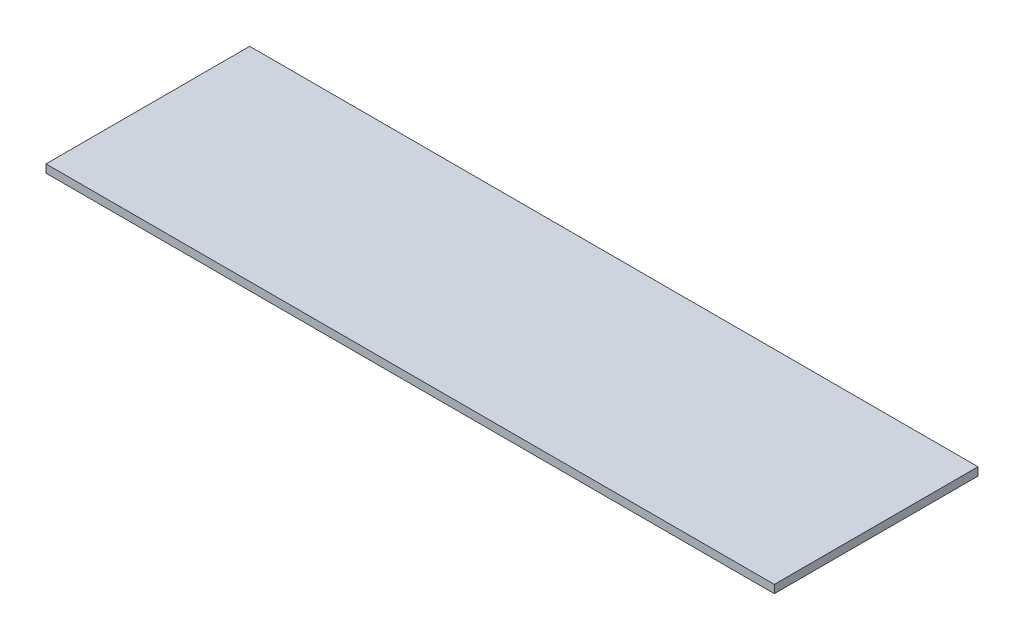
ISO-10303-21;
HEADER;
FILE_DESCRIPTION(('STEP AP214'),'2;1');
FILE_NAME('part.step','',(''),(''),'','','');
FILE_SCHEMA(('AUTOMOTIVE_DESIGN { 1 0 10303 214 1 1 1 1 }'));
ENDSEC;
DATA;
#1=APPLICATION_CONTEXT('core data for automotive mechanical design processes');
#2=APPLICATION_PROTOCOL_DEFINITION('international standard','automotive_design',2000,#1);
#3=PRODUCT_CONTEXT('',#1,'mechanical');
#4=PRODUCT('Part','Part','',(#3));
#5=PRODUCT_RELATED_PRODUCT_CATEGORY('part','',(#4));
#6=PRODUCT_DEFINITION_FORMATION('','',#4);
#7=PRODUCT_DEFINITION_CONTEXT('part definition',#1,'design');
#8=PRODUCT_DEFINITION('design','',#6,#7);
#9=PRODUCT_DEFINITION_SHAPE('','',#8);
#10=(LENGTH_UNIT() NAMED_UNIT(*) SI_UNIT(.MILLI.,.METRE.));
#11=(NAMED_UNIT(*) PLANE_ANGLE_UNIT() SI_UNIT($,.RADIAN.));
#12=(NAMED_UNIT(*) SI_UNIT($,.STERADIAN.) SOLID_ANGLE_UNIT());
#13=UNCERTAINTY_MEASURE_WITH_UNIT(LENGTH_MEASURE(1.E-05),#10,'distance_accuracy_value','');
#14=(GEOMETRIC_REPRESENTATION_CONTEXT(3) GLOBAL_UNCERTAINTY_ASSIGNED_CONTEXT((#13)) GLOBAL_UNIT_ASSIGNED_CONTEXT((#10,
#11,#12)) REPRESENTATION_CONTEXT('',''));
#15=CARTESIAN_POINT('',(0.,0.,0.));
#16=DIRECTION('',(0.,0.,1.));
#17=DIRECTION('',(1.,0.,0.));
#18=AXIS2_PLACEMENT_3D('',#15,#16,#17);
#19=CARTESIAN_POINT('',(450.,5.,-125.85));
#20=DIRECTION('',(-1.,0.,0.));
#21=DIRECTION('',(0.,0.,1.));
#22=AXIS2_PLACEMENT_3D('',#19,#20,#21);
#23=PLANE('',#22);
#24=DIRECTION('',(0.,0.,-1.));
#25=VECTOR('',#24,1.);
#26=CARTESIAN_POINT('',(450.,-5.,-125.85));
#27=LINE('',#26,#25);
#28=CARTESIAN_POINT('',(450.,-5.,125.85));
#29=VERTEX_POINT('',#28);
#30=CARTESIAN_POINT('',(450.,-5.,-125.85));
#31=VERTEX_POINT('',#30);
#32=EDGE_CURVE('E109',#29,#31,#27,.T.);
#33=ORIENTED_EDGE('',*,*,#32,.T.);
#34=DIRECTION('',(0.,-1.,0.));
#35=VECTOR('',#34,1.);
#36=CARTESIAN_POINT('',(450.,5.,-125.85));
#37=LINE('',#36,#35);
#38=CARTESIAN_POINT('',(450.,5.,-125.85));
#39=VERTEX_POINT('',#38);
#40=EDGE_CURVE('E11',#39,#31,#37,.T.);
#41=ORIENTED_EDGE('',*,*,#40,.F.);
#42=DIRECTION('',(0.,0.,-1.));
#43=VECTOR('',#42,1.);
#44=CARTESIAN_POINT('',(450.,5.,-125.85));
#45=LINE('',#44,#43);
#46=CARTESIAN_POINT('',(450.,5.,125.85));
#47=VERTEX_POINT('',#46);
#48=EDGE_CURVE('E93',#47,#39,#45,.T.);
#49=ORIENTED_EDGE('',*,*,#48,.F.);
#50=DIRECTION('',(0.,-1.,0.));
#51=VECTOR('',#50,1.);
#52=CARTESIAN_POINT('',(450.,5.,125.85));
#53=LINE('',#52,#51);
#54=EDGE_CURVE('E105',#47,#29,#53,.T.);
#55=ORIENTED_EDGE('',*,*,#54,.T.);
#56=EDGE_LOOP('',(#33,#41,#49,#55));
#57=FACE_BOUND('',#56,.T.);
#58=ADVANCED_FACE('F41',(#57),#23,.F.);
#59=CARTESIAN_POINT('',(-450.,5.,-125.85));
#60=DIRECTION('',(0.,0.,1.));
#61=DIRECTION('',(1.,0.,0.));
#62=AXIS2_PLACEMENT_3D('',#59,#60,#61);
#63=PLANE('',#62);
#64=DIRECTION('',(-1.,0.,0.));
#65=VECTOR('',#64,1.);
#66=CARTESIAN_POINT('',(-450.,-5.,-125.85));
#67=LINE('',#66,#65);
#68=CARTESIAN_POINT('',(-450.,-5.,-125.85));
#69=VERTEX_POINT('',#68);
#70=EDGE_CURVE('E98',#31,#69,#67,.T.);
#71=ORIENTED_EDGE('',*,*,#70,.T.);
#72=DIRECTION('',(0.,-1.,0.));
#73=VECTOR('',#72,1.);
#74=CARTESIAN_POINT('',(-450.,5.,-125.85));
#75=LINE('',#74,#73);
#76=CARTESIAN_POINT('',(-450.,5.,-125.85));
#77=VERTEX_POINT('',#76);
#78=EDGE_CURVE('E50',#77,#69,#75,.T.);
#79=ORIENTED_EDGE('',*,*,#78,.F.);
#80=DIRECTION('',(-1.,0.,0.));
#81=VECTOR('',#80,1.);
#82=CARTESIAN_POINT('',(-450.,5.,-125.85));
#83=LINE('',#82,#81);
#84=EDGE_CURVE('E88',#39,#77,#83,.T.);
#85=ORIENTED_EDGE('',*,*,#84,.F.);
#86=ORIENTED_EDGE('',*,*,#40,.T.);
#87=EDGE_LOOP('',(#71,#79,#85,#86));
#88=FACE_BOUND('',#87,.T.);
#89=ADVANCED_FACE('F97',(#88),#63,.F.);
#90=CARTESIAN_POINT('',(-450.,5.,-125.85));
#91=DIRECTION('',(1.,0.,0.));
#92=DIRECTION('',(0.,0.,-1.));
#93=AXIS2_PLACEMENT_3D('',#90,#91,#92);
#94=PLANE('',#93);
#95=DIRECTION('',(0.,0.,1.));
#96=VECTOR('',#95,1.);
#97=CARTESIAN_POINT('',(-450.,-5.,-125.85));
#98=LINE('',#97,#96);
#99=CARTESIAN_POINT('',(-450.,-5.,125.85));
#100=VERTEX_POINT('',#99);
#101=EDGE_CURVE('E75',#69,#100,#98,.T.);
#102=ORIENTED_EDGE('',*,*,#101,.T.);
#103=DIRECTION('',(0.,-1.,0.));
#104=VECTOR('',#103,1.);
#105=CARTESIAN_POINT('',(-450.,5.,125.85));
#106=LINE('',#105,#104);
#107=CARTESIAN_POINT('',(-450.,5.,125.85));
#108=VERTEX_POINT('',#107);
#109=EDGE_CURVE('E100',#108,#100,#106,.T.);
#110=ORIENTED_EDGE('',*,*,#109,.F.);
#111=DIRECTION('',(0.,0.,1.));
#112=VECTOR('',#111,1.);
#113=CARTESIAN_POINT('',(-450.,5.,-125.85));
#114=LINE('',#113,#112);
#115=EDGE_CURVE('E91',#77,#108,#114,.T.);
#116=ORIENTED_EDGE('',*,*,#115,.F.);
#117=ORIENTED_EDGE('',*,*,#78,.T.);
#118=EDGE_LOOP('',(#102,#110,#116,#117));
#119=FACE_BOUND('',#118,.T.);
#120=ADVANCED_FACE('F101',(#119),#94,.F.);
#121=CARTESIAN_POINT('',(-450.,5.,125.85));
#122=DIRECTION('',(0.,0.,-1.));
#123=DIRECTION('',(-1.,0.,0.));
#124=AXIS2_PLACEMENT_3D('',#121,#122,#123);
#125=PLANE('',#124);
#126=DIRECTION('',(1.,0.,0.));
#127=VECTOR('',#126,1.);
#128=CARTESIAN_POINT('',(-450.,-5.,125.85));
#129=LINE('',#128,#127);
#130=EDGE_CURVE('E81',#100,#29,#129,.T.);
#131=ORIENTED_EDGE('',*,*,#130,.T.);
#132=ORIENTED_EDGE('',*,*,#54,.F.);
#133=DIRECTION('',(1.,0.,0.));
#134=VECTOR('',#133,1.);
#135=CARTESIAN_POINT('',(-450.,5.,125.85));
#136=LINE('',#135,#134);
#137=EDGE_CURVE('E58',#108,#47,#136,.T.);
#138=ORIENTED_EDGE('',*,*,#137,.F.);
#139=ORIENTED_EDGE('',*,*,#109,.T.);
#140=EDGE_LOOP('',(#131,#132,#138,#139));
#141=FACE_BOUND('',#140,.T.);
#142=ADVANCED_FACE('F122',(#141),#125,.F.);
#143=CARTESIAN_POINT('',(0.,5.,0.));
#144=DIRECTION('',(0.,1.,0.));
#145=DIRECTION('',(0.,0.,1.));
#146=AXIS2_PLACEMENT_3D('',#143,#144,#145);
#147=PLANE('',#146);
#148=ORIENTED_EDGE('',*,*,#48,.T.);
#149=ORIENTED_EDGE('',*,*,#84,.T.);
#150=ORIENTED_EDGE('',*,*,#115,.T.);
#151=ORIENTED_EDGE('',*,*,#137,.T.);
#152=EDGE_LOOP('',(#148,#149,#150,#151));
#153=FACE_BOUND('',#152,.T.);
#154=ADVANCED_FACE('F89',(#153),#147,.T.);
#155=CARTESIAN_POINT('',(0.,-5.,0.));
#156=DIRECTION('',(0.,1.,0.));
#157=DIRECTION('',(0.,0.,1.));
#158=AXIS2_PLACEMENT_3D('',#155,#156,#157);
#159=PLANE('',#158);
#160=ORIENTED_EDGE('',*,*,#32,.F.);
#161=ORIENTED_EDGE('',*,*,#130,.F.);
#162=ORIENTED_EDGE('',*,*,#101,.F.);
#163=ORIENTED_EDGE('',*,*,#70,.F.);
#164=EDGE_LOOP('',(#160,#161,#162,#163));
#165=FACE_BOUND('',#164,.T.);
#166=ADVANCED_FACE('F125',(#165),#159,.F.);
#167=CLOSED_SHELL('',(#58,#89,#120,#142,#154,#166));
#168=MANIFOLD_SOLID_BREP('B2',#167);
#169=ADVANCED_BREP_SHAPE_REPRESENTATION('',(#18,#168),#14);
#170=SHAPE_DEFINITION_REPRESENTATION(#9,#169);
ENDSEC;
END-ISO-10303-21;
